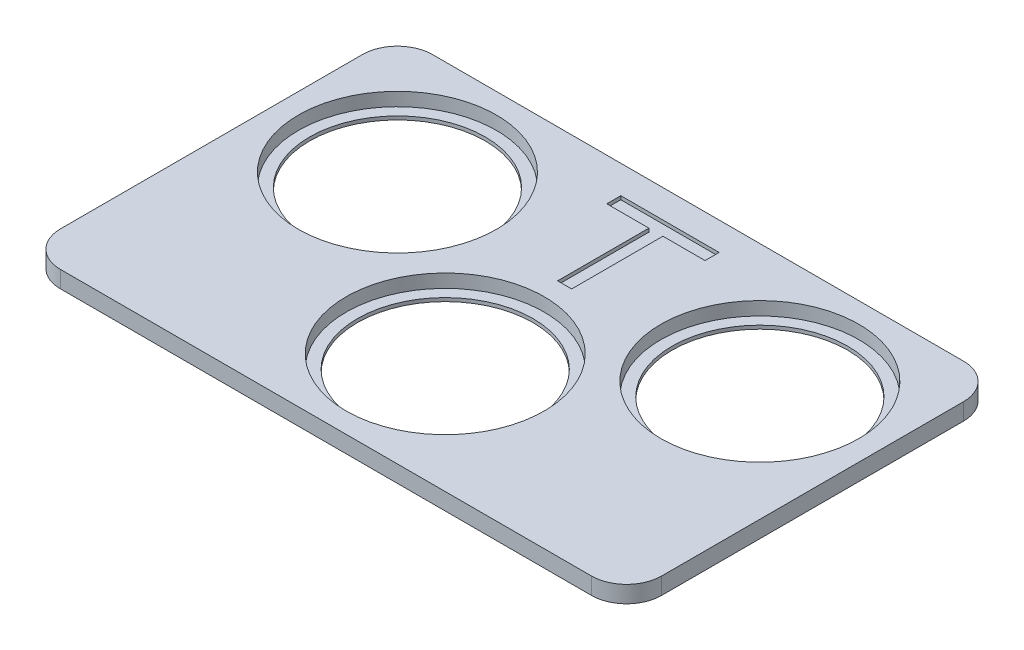
ISO-10303-21;
HEADER;
FILE_DESCRIPTION(('STEP AP214'),'2;1');
FILE_NAME('part.step','',(''),(''),'','','');
FILE_SCHEMA(('AUTOMOTIVE_DESIGN { 1 0 10303 214 1 1 1 1 }'));
ENDSEC;
DATA;
#1=APPLICATION_CONTEXT('core data for automotive mechanical design processes');
#2=APPLICATION_PROTOCOL_DEFINITION('international standard','automotive_design',2000,#1);
#3=PRODUCT_CONTEXT('',#1,'mechanical');
#4=PRODUCT('Part','Part','',(#3));
#5=PRODUCT_RELATED_PRODUCT_CATEGORY('part','',(#4));
#6=PRODUCT_DEFINITION_FORMATION('','',#4);
#7=PRODUCT_DEFINITION_CONTEXT('part definition',#1,'design');
#8=PRODUCT_DEFINITION('design','',#6,#7);
#9=PRODUCT_DEFINITION_SHAPE('','',#8);
#10=(LENGTH_UNIT() NAMED_UNIT(*) SI_UNIT(.MILLI.,.METRE.));
#11=(NAMED_UNIT(*) PLANE_ANGLE_UNIT() SI_UNIT($,.RADIAN.));
#12=(NAMED_UNIT(*) SI_UNIT($,.STERADIAN.) SOLID_ANGLE_UNIT());
#13=UNCERTAINTY_MEASURE_WITH_UNIT(LENGTH_MEASURE(1.E-05),#10,'distance_accuracy_value','');
#14=(GEOMETRIC_REPRESENTATION_CONTEXT(3) GLOBAL_UNCERTAINTY_ASSIGNED_CONTEXT((#13)) GLOBAL_UNIT_ASSIGNED_CONTEXT((#10,
#11,#12)) REPRESENTATION_CONTEXT('',''));
#15=CARTESIAN_POINT('',(0.,0.,0.));
#16=DIRECTION('',(0.,0.,1.));
#17=DIRECTION('',(1.,0.,0.));
#18=AXIS2_PLACEMENT_3D('',#15,#16,#17);
#19=CARTESIAN_POINT('',(42.8000000000002,2.4,-26.4899999999999));
#20=DIRECTION('',(-1.,0.,0.));
#21=DIRECTION('',(0.,0.,1.));
#22=AXIS2_PLACEMENT_3D('',#19,#20,#21);
#23=PLANE('',#22);
#24=DIRECTION('',(0.,0.,-1.));
#25=VECTOR('',#24,1.);
#26=CARTESIAN_POINT('',(42.8000000000002,0.,-26.4899999999999));
#27=LINE('',#26,#25);
#28=CARTESIAN_POINT('',(42.8000000000002,0.,21.4900000000001));
#29=VERTEX_POINT('',#28);
#30=CARTESIAN_POINT('',(42.8000000000002,0.,-21.4899999999999));
#31=VERTEX_POINT('',#30);
#32=EDGE_CURVE('E256',#29,#31,#27,.T.);
#33=ORIENTED_EDGE('',*,*,#32,.T.);
#34=DIRECTION('',(0.,-1.,0.));
#35=VECTOR('',#34,1.);
#36=CARTESIAN_POINT('',(42.8000000000002,2.4,-21.4899999999999));
#37=LINE('',#36,#35);
#38=CARTESIAN_POINT('',(42.8000000000002,2.4,-21.4899999999999));
#39=VERTEX_POINT('',#38);
#40=EDGE_CURVE('E322',#31,#39,#37,.F.);
#41=ORIENTED_EDGE('',*,*,#40,.T.);
#42=DIRECTION('',(0.,0.,-1.));
#43=VECTOR('',#42,1.);
#44=CARTESIAN_POINT('',(42.8000000000002,2.4,-26.4899999999999));
#45=LINE('',#44,#43);
#46=CARTESIAN_POINT('',(42.8000000000002,2.4,21.4900000000001));
#47=VERTEX_POINT('',#46);
#48=EDGE_CURVE('E260',#47,#39,#45,.T.);
#49=ORIENTED_EDGE('',*,*,#48,.F.);
#50=DIRECTION('',(0.,-1.,0.));
#51=VECTOR('',#50,1.);
#52=CARTESIAN_POINT('',(42.8000000000002,2.4,21.4900000000001));
#53=LINE('',#52,#51);
#54=EDGE_CURVE('E318',#47,#29,#53,.T.);
#55=ORIENTED_EDGE('',*,*,#54,.T.);
#56=EDGE_LOOP('',(#33,#41,#49,#55));
#57=FACE_BOUND('',#56,.T.);
#58=ADVANCED_FACE('F39',(#57),#23,.F.);
#59=CARTESIAN_POINT('',(-42.7999999999998,2.4,-26.4899999999999));
#60=DIRECTION('',(0.,0.,1.));
#61=DIRECTION('',(1.,0.,0.));
#62=AXIS2_PLACEMENT_3D('',#59,#60,#61);
#63=PLANE('',#62);
#64=DIRECTION('',(-1.,0.,0.));
#65=VECTOR('',#64,1.);
#66=CARTESIAN_POINT('',(-42.7999999999998,2.4,-26.4899999999999));
#67=LINE('',#66,#65);
#68=CARTESIAN_POINT('',(37.8000000000002,2.4,-26.4899999999999));
#69=VERTEX_POINT('',#68);
#70=CARTESIAN_POINT('',(-37.7999999999998,2.4,-26.4899999999999));
#71=VERTEX_POINT('',#70);
#72=EDGE_CURVE('E264',#69,#71,#67,.T.);
#73=ORIENTED_EDGE('',*,*,#72,.F.);
#74=DIRECTION('',(0.,-1.,0.));
#75=VECTOR('',#74,1.);
#76=CARTESIAN_POINT('',(37.8000000000002,2.4,-26.4899999999999));
#77=LINE('',#76,#75);
#78=CARTESIAN_POINT('',(37.8000000000002,0.,-26.4899999999999));
#79=VERTEX_POINT('',#78);
#80=EDGE_CURVE('E302',#69,#79,#77,.T.);
#81=ORIENTED_EDGE('',*,*,#80,.T.);
#82=DIRECTION('',(-1.,0.,0.));
#83=VECTOR('',#82,1.);
#84=CARTESIAN_POINT('',(-42.7999999999998,0.,-26.4899999999999));
#85=LINE('',#84,#83);
#86=CARTESIAN_POINT('',(-37.7999999999998,0.,-26.4899999999999));
#87=VERTEX_POINT('',#86);
#88=EDGE_CURVE('E280',#79,#87,#85,.T.);
#89=ORIENTED_EDGE('',*,*,#88,.T.);
#90=DIRECTION('',(0.,-1.,0.));
#91=VECTOR('',#90,1.);
#92=CARTESIAN_POINT('',(-37.7999999999998,2.4,-26.4899999999999));
#93=LINE('',#92,#91);
#94=EDGE_CURVE('E276',#87,#71,#93,.F.);
#95=ORIENTED_EDGE('',*,*,#94,.T.);
#96=EDGE_LOOP('',(#73,#81,#89,#95));
#97=FACE_BOUND('',#96,.T.);
#98=ADVANCED_FACE('F404',(#97),#63,.F.);
#99=CARTESIAN_POINT('',(-42.7999999999998,2.4,-26.4899999999999));
#100=DIRECTION('',(1.,0.,0.));
#101=DIRECTION('',(0.,0.,-1.));
#102=AXIS2_PLACEMENT_3D('',#99,#100,#101);
#103=PLANE('',#102);
#104=DIRECTION('',(0.,0.,1.));
#105=VECTOR('',#104,1.);
#106=CARTESIAN_POINT('',(-42.7999999999998,0.,-26.4899999999999));
#107=LINE('',#106,#105);
#108=CARTESIAN_POINT('',(-42.7999999999998,0.,-21.4899999999999));
#109=VERTEX_POINT('',#108);
#110=CARTESIAN_POINT('',(-42.7999999999998,0.,21.4900000000001));
#111=VERTEX_POINT('',#110);
#112=EDGE_CURVE('E284',#109,#111,#107,.T.);
#113=ORIENTED_EDGE('',*,*,#112,.T.);
#114=DIRECTION('',(0.,-1.,0.));
#115=VECTOR('',#114,1.);
#116=CARTESIAN_POINT('',(-42.7999999999998,2.4,21.4900000000001));
#117=LINE('',#116,#115);
#118=CARTESIAN_POINT('',(-42.7999999999998,2.4,21.4900000000001));
#119=VERTEX_POINT('',#118);
#120=EDGE_CURVE('E347',#111,#119,#117,.F.);
#121=ORIENTED_EDGE('',*,*,#120,.T.);
#122=DIRECTION('',(0.,0.,1.));
#123=VECTOR('',#122,1.);
#124=CARTESIAN_POINT('',(-42.7999999999998,2.4,-26.4899999999999));
#125=LINE('',#124,#123);
#126=CARTESIAN_POINT('',(-42.7999999999998,2.4,-21.4899999999999));
#127=VERTEX_POINT('',#126);
#128=EDGE_CURVE('E269',#127,#119,#125,.T.);
#129=ORIENTED_EDGE('',*,*,#128,.F.);
#130=DIRECTION('',(0.,-1.,0.));
#131=VECTOR('',#130,1.);
#132=CARTESIAN_POINT('',(-42.7999999999998,2.4,-21.4899999999999));
#133=LINE('',#132,#131);
#134=EDGE_CURVE('E343',#127,#109,#133,.T.);
#135=ORIENTED_EDGE('',*,*,#134,.T.);
#136=EDGE_LOOP('',(#113,#121,#129,#135));
#137=FACE_BOUND('',#136,.T.);
#138=ADVANCED_FACE('F410',(#137),#103,.F.);
#139=CARTESIAN_POINT('',(-42.7999999999998,2.4,26.4900000000001));
#140=DIRECTION('',(0.,0.,-1.));
#141=DIRECTION('',(-1.,0.,0.));
#142=AXIS2_PLACEMENT_3D('',#139,#140,#141);
#143=PLANE('',#142);
#144=DIRECTION('',(1.,0.,0.));
#145=VECTOR('',#144,1.);
#146=CARTESIAN_POINT('',(-42.7999999999998,0.,26.4900000000001));
#147=LINE('',#146,#145);
#148=CARTESIAN_POINT('',(-37.7999999999998,0.,26.4900000000001));
#149=VERTEX_POINT('',#148);
#150=CARTESIAN_POINT('',(37.8000000000002,0.,26.4900000000001));
#151=VERTEX_POINT('',#150);
#152=EDGE_CURVE('E265',#149,#151,#147,.T.);
#153=ORIENTED_EDGE('',*,*,#152,.T.);
#154=DIRECTION('',(0.,-1.,0.));
#155=VECTOR('',#154,1.);
#156=CARTESIAN_POINT('',(37.8000000000002,2.4,26.4900000000001));
#157=LINE('',#156,#155);
#158=CARTESIAN_POINT('',(37.8000000000002,2.4,26.4900000000001));
#159=VERTEX_POINT('',#158);
#160=EDGE_CURVE('E63',#151,#159,#157,.F.);
#161=ORIENTED_EDGE('',*,*,#160,.T.);
#162=DIRECTION('',(1.,0.,0.));
#163=VECTOR('',#162,1.);
#164=CARTESIAN_POINT('',(-42.7999999999998,2.4,26.4900000000001));
#165=LINE('',#164,#163);
#166=CARTESIAN_POINT('',(-37.7999999999998,2.4,26.4900000000001));
#167=VERTEX_POINT('',#166);
#168=EDGE_CURVE('E273',#167,#159,#165,.T.);
#169=ORIENTED_EDGE('',*,*,#168,.F.);
#170=DIRECTION('',(0.,-1.,0.));
#171=VECTOR('',#170,1.);
#172=CARTESIAN_POINT('',(-37.7999999999998,2.4,26.4900000000001));
#173=LINE('',#172,#171);
#174=EDGE_CURVE('E337',#167,#149,#173,.T.);
#175=ORIENTED_EDGE('',*,*,#174,.T.);
#176=EDGE_LOOP('',(#153,#161,#169,#175));
#177=FACE_BOUND('',#176,.T.);
#178=ADVANCED_FACE('F436',(#177),#143,.F.);
#179=CARTESIAN_POINT('',(0.,2.4,0.));
#180=DIRECTION('',(0.,1.,0.));
#181=DIRECTION('',(0.,0.,1.));
#182=AXIS2_PLACEMENT_3D('',#179,#180,#181);
#183=PLANE('',#182);
#184=DIRECTION('',(0.,0.,-1.));
#185=VECTOR('',#184,1.);
#186=CARTESIAN_POINT('',(0.999999999999999,2.4,0.));
#187=LINE('',#186,#185);
#188=CARTESIAN_POINT('',(1.,2.4,-7.48999999999991));
#189=VERTEX_POINT('',#188);
#190=CARTESIAN_POINT('',(1.,2.4,-20.4899999999999));
#191=VERTEX_POINT('',#190);
#192=EDGE_CURVE('E11',#189,#191,#187,.T.);
#193=ORIENTED_EDGE('',*,*,#192,.F.);
#194=DIRECTION('',(-1.,0.,0.));
#195=VECTOR('',#194,1.);
#196=CARTESIAN_POINT('',(0.,2.4,-7.48999999999991));
#197=LINE('',#196,#195);
#198=CARTESIAN_POINT('',(-1.,2.4,-7.48999999999991));
#199=VERTEX_POINT('',#198);
#200=EDGE_CURVE('E350',#189,#199,#197,.T.);
#201=ORIENTED_EDGE('',*,*,#200,.T.);
#202=DIRECTION('',(0.,0.,-1.));
#203=VECTOR('',#202,1.);
#204=CARTESIAN_POINT('',(-0.999999999999999,2.4,0.));
#205=LINE('',#204,#203);
#206=CARTESIAN_POINT('',(-1.,2.4,-20.4899999999999));
#207=VERTEX_POINT('',#206);
#208=EDGE_CURVE('E354',#199,#207,#205,.T.);
#209=ORIENTED_EDGE('',*,*,#208,.T.);
#210=DIRECTION('',(-1.,0.,0.));
#211=VECTOR('',#210,1.);
#212=CARTESIAN_POINT('',(0.,2.4,-20.4899999999999));
#213=LINE('',#212,#211);
#214=CARTESIAN_POINT('',(-7.,2.4,-20.4899999999999));
#215=VERTEX_POINT('',#214);
#216=EDGE_CURVE('E358',#207,#215,#213,.T.);
#217=ORIENTED_EDGE('',*,*,#216,.T.);
#218=DIRECTION('',(0.,0.,-1.));
#219=VECTOR('',#218,1.);
#220=CARTESIAN_POINT('',(-7.00000000000002,2.4,0.));
#221=LINE('',#220,#219);
#222=CARTESIAN_POINT('',(-7.,2.4,-22.4899999999999));
#223=VERTEX_POINT('',#222);
#224=EDGE_CURVE('E362',#215,#223,#221,.T.);
#225=ORIENTED_EDGE('',*,*,#224,.T.);
#226=DIRECTION('',(-1.,0.,0.));
#227=VECTOR('',#226,1.);
#228=CARTESIAN_POINT('',(0.,2.4,-22.4899999999999));
#229=LINE('',#228,#227);
#230=CARTESIAN_POINT('',(7.,2.4,-22.4899999999999));
#231=VERTEX_POINT('',#230);
#232=EDGE_CURVE('E366',#231,#223,#229,.T.);
#233=ORIENTED_EDGE('',*,*,#232,.F.);
#234=DIRECTION('',(0.,0.,-1.));
#235=VECTOR('',#234,1.);
#236=CARTESIAN_POINT('',(7.,2.4,0.));
#237=LINE('',#236,#235);
#238=CARTESIAN_POINT('',(7.,2.4,-20.4899999999999));
#239=VERTEX_POINT('',#238);
#240=EDGE_CURVE('E369',#239,#231,#237,.T.);
#241=ORIENTED_EDGE('',*,*,#240,.F.);
#242=DIRECTION('',(-1.,0.,0.));
#243=VECTOR('',#242,1.);
#244=CARTESIAN_POINT('',(0.,2.4,-20.4899999999999));
#245=LINE('',#244,#243);
#246=EDGE_CURVE('E48',#239,#191,#245,.T.);
#247=ORIENTED_EDGE('',*,*,#246,.T.);
#248=EDGE_LOOP('',(#193,#201,#209,#217,#225,#233,#241,#247));
#249=FACE_BOUND('',#248,.T.);
#250=CARTESIAN_POINT('',(0.,2.4,9.51000000000009));
#251=DIRECTION('',(0.,1.,0.));
#252=DIRECTION('',(0.,0.,1.));
#253=AXIS2_PLACEMENT_3D('',#250,#251,#252);
#254=CIRCLE('',#253,14.1);
#255=CARTESIAN_POINT('',(0.,2.4,23.6100000000001));
#256=VERTEX_POINT('',#255);
#257=EDGE_CURVE('E238',#256,#256,#254,.T.);
#258=ORIENTED_EDGE('',*,*,#257,.F.);
#259=EDGE_LOOP('',(#258));
#260=FACE_BOUND('',#259,.T.);
#261=CARTESIAN_POINT('',(25.8000000000002,2.4,-9.4899999999999));
#262=DIRECTION('',(0.,1.,0.));
#263=DIRECTION('',(0.,0.,1.));
#264=AXIS2_PLACEMENT_3D('',#261,#262,#263);
#265=CIRCLE('',#264,14.1);
#266=CARTESIAN_POINT('',(25.8000000000002,2.4,4.6100000000001));
#267=VERTEX_POINT('',#266);
#268=EDGE_CURVE('E239',#267,#267,#265,.T.);
#269=ORIENTED_EDGE('',*,*,#268,.F.);
#270=EDGE_LOOP('',(#269));
#271=FACE_BOUND('',#270,.T.);
#272=CARTESIAN_POINT('',(-25.7999999999998,2.4,-9.4899999999999));
#273=DIRECTION('',(0.,1.,0.));
#274=DIRECTION('',(0.,0.,1.));
#275=AXIS2_PLACEMENT_3D('',#272,#273,#274);
#276=CIRCLE('',#275,14.1);
#277=CARTESIAN_POINT('',(-25.7999999999998,2.4,4.6100000000001));
#278=VERTEX_POINT('',#277);
#279=EDGE_CURVE('E248',#278,#278,#276,.T.);
#280=ORIENTED_EDGE('',*,*,#279,.F.);
#281=EDGE_LOOP('',(#280));
#282=FACE_BOUND('',#281,.T.);
#283=ORIENTED_EDGE('',*,*,#48,.T.);
#284=CARTESIAN_POINT('',(37.8000000000002,2.4,-21.4899999999999));
#285=DIRECTION('',(0.,1.,0.));
#286=DIRECTION('',(0.,0.,1.));
#287=AXIS2_PLACEMENT_3D('',#284,#285,#286);
#288=CIRCLE('',#287,5.);
#289=EDGE_CURVE('E334',#39,#69,#288,.T.);
#290=ORIENTED_EDGE('',*,*,#289,.T.);
#291=ORIENTED_EDGE('',*,*,#72,.T.);
#292=CARTESIAN_POINT('',(-37.7999999999998,2.4,-21.4899999999999));
#293=DIRECTION('',(0.,1.,0.));
#294=DIRECTION('',(0.,0.,1.));
#295=AXIS2_PLACEMENT_3D('',#292,#293,#294);
#296=CIRCLE('',#295,5.);
#297=EDGE_CURVE('E325',#71,#127,#296,.T.);
#298=ORIENTED_EDGE('',*,*,#297,.T.);
#299=ORIENTED_EDGE('',*,*,#128,.T.);
#300=CARTESIAN_POINT('',(-37.7999999999998,2.4,21.4900000000001));
#301=DIRECTION('',(0.,1.,0.));
#302=DIRECTION('',(0.,0.,1.));
#303=AXIS2_PLACEMENT_3D('',#300,#301,#302);
#304=CIRCLE('',#303,5.);
#305=EDGE_CURVE('E328',#119,#167,#304,.T.);
#306=ORIENTED_EDGE('',*,*,#305,.T.);
#307=ORIENTED_EDGE('',*,*,#168,.T.);
#308=CARTESIAN_POINT('',(37.8000000000002,2.4,21.4900000000001));
#309=DIRECTION('',(0.,1.,0.));
#310=DIRECTION('',(0.,0.,1.));
#311=AXIS2_PLACEMENT_3D('',#308,#309,#310);
#312=CIRCLE('',#311,5.);
#313=EDGE_CURVE('E331',#159,#47,#312,.T.);
#314=ORIENTED_EDGE('',*,*,#313,.T.);
#315=EDGE_LOOP('',(#283,#290,#291,#298,#299,#306,#307,#314));
#316=FACE_BOUND('',#315,.T.);
#317=ADVANCED_FACE('F374',(#249,#260,#271,#282,#316),#183,.T.);
#318=CARTESIAN_POINT('',(0.,0.,0.));
#319=DIRECTION('',(0.,1.,0.));
#320=DIRECTION('',(0.,0.,1.));
#321=AXIS2_PLACEMENT_3D('',#318,#319,#320);
#322=PLANE('',#321);
#323=CARTESIAN_POINT('',(-25.7999999999998,0.,-9.4899999999999));
#324=DIRECTION('',(0.,1.,0.));
#325=DIRECTION('',(0.,0.,1.));
#326=AXIS2_PLACEMENT_3D('',#323,#324,#325);
#327=CIRCLE('',#326,12.5);
#328=CARTESIAN_POINT('',(-25.7999999999998,0.,3.0100000000001));
#329=VERTEX_POINT('',#328);
#330=EDGE_CURVE('E243',#329,#329,#327,.T.);
#331=ORIENTED_EDGE('',*,*,#330,.T.);
#332=EDGE_LOOP('',(#331));
#333=FACE_BOUND('',#332,.T.);
#334=CARTESIAN_POINT('',(0.,0.,9.51000000000009));
#335=DIRECTION('',(0.,1.,0.));
#336=DIRECTION('',(0.,0.,1.));
#337=AXIS2_PLACEMENT_3D('',#334,#335,#336);
#338=CIRCLE('',#337,12.5);
#339=CARTESIAN_POINT('',(0.,0.,22.0100000000001));
#340=VERTEX_POINT('',#339);
#341=EDGE_CURVE('E293',#340,#340,#338,.T.);
#342=ORIENTED_EDGE('',*,*,#341,.T.);
#343=EDGE_LOOP('',(#342));
#344=FACE_BOUND('',#343,.T.);
#345=CARTESIAN_POINT('',(25.8000000000002,0.,-9.4899999999999));
#346=DIRECTION('',(0.,1.,0.));
#347=DIRECTION('',(0.,0.,1.));
#348=AXIS2_PLACEMENT_3D('',#345,#346,#347);
#349=CIRCLE('',#348,12.5);
#350=CARTESIAN_POINT('',(25.8000000000002,0.,3.0100000000001));
#351=VERTEX_POINT('',#350);
#352=EDGE_CURVE('E226',#351,#351,#349,.T.);
#353=ORIENTED_EDGE('',*,*,#352,.T.);
#354=EDGE_LOOP('',(#353));
#355=FACE_BOUND('',#354,.T.);
#356=ORIENTED_EDGE('',*,*,#88,.F.);
#357=CARTESIAN_POINT('',(37.8000000000002,0.,-21.4899999999999));
#358=DIRECTION('',(0.,1.,0.));
#359=DIRECTION('',(0.,0.,1.));
#360=AXIS2_PLACEMENT_3D('',#357,#358,#359);
#361=CIRCLE('',#360,5.);
#362=EDGE_CURVE('E315',#79,#31,#361,.F.);
#363=ORIENTED_EDGE('',*,*,#362,.T.);
#364=ORIENTED_EDGE('',*,*,#32,.F.);
#365=CARTESIAN_POINT('',(37.8000000000002,0.,21.4900000000001));
#366=DIRECTION('',(0.,1.,0.));
#367=DIRECTION('',(0.,0.,1.));
#368=AXIS2_PLACEMENT_3D('',#365,#366,#367);
#369=CIRCLE('',#368,5.);
#370=EDGE_CURVE('E312',#29,#151,#369,.F.);
#371=ORIENTED_EDGE('',*,*,#370,.T.);
#372=ORIENTED_EDGE('',*,*,#152,.F.);
#373=CARTESIAN_POINT('',(-37.7999999999998,0.,21.4900000000001));
#374=DIRECTION('',(0.,1.,0.));
#375=DIRECTION('',(0.,0.,1.));
#376=AXIS2_PLACEMENT_3D('',#373,#374,#375);
#377=CIRCLE('',#376,5.);
#378=EDGE_CURVE('E309',#149,#111,#377,.F.);
#379=ORIENTED_EDGE('',*,*,#378,.T.);
#380=ORIENTED_EDGE('',*,*,#112,.F.);
#381=CARTESIAN_POINT('',(-37.7999999999998,0.,-21.4899999999999));
#382=DIRECTION('',(0.,1.,0.));
#383=DIRECTION('',(0.,0.,1.));
#384=AXIS2_PLACEMENT_3D('',#381,#382,#383);
#385=CIRCLE('',#384,5.);
#386=EDGE_CURVE('E306',#109,#87,#385,.F.);
#387=ORIENTED_EDGE('',*,*,#386,.T.);
#388=EDGE_LOOP('',(#356,#363,#364,#371,#372,#379,#380,#387));
#389=FACE_BOUND('',#388,.T.);
#390=ADVANCED_FACE('F440',(#333,#344,#355,#389),#322,.F.);
#391=CARTESIAN_POINT('',(-25.7999999999998,0.5,-9.4899999999999));
#392=DIRECTION('',(0.,1.,0.));
#393=DIRECTION('',(0.,0.,1.));
#394=AXIS2_PLACEMENT_3D('',#391,#392,#393);
#395=CYLINDRICAL_SURFACE('',#394,14.1);
#396=CARTESIAN_POINT('',(-25.7999999999998,0.5,-9.4899999999999));
#397=DIRECTION('',(0.,1.,0.));
#398=DIRECTION('',(0.,0.,1.));
#399=AXIS2_PLACEMENT_3D('',#396,#397,#398);
#400=CIRCLE('',#399,14.1);
#401=CARTESIAN_POINT('',(-25.7999999999998,0.5,4.6100000000001));
#402=VERTEX_POINT('',#401);
#403=EDGE_CURVE('E252',#402,#402,#400,.T.);
#404=CARTESIAN_POINT('',(-25.7999999999998,0.5,4.6100000000001));
#405=CARTESIAN_POINT('',(-25.7999999999998,0.519791666666666,4.6100000000001));
#406=CARTESIAN_POINT('',(-25.7999999999998,0.539583333333333,4.6100000000001));
#407=CARTESIAN_POINT('',(-25.7999999999998,0.579166666666666,4.6100000000001));
#408=CARTESIAN_POINT('',(-25.7999999999998,0.598958333333333,4.6100000000001));
#409=CARTESIAN_POINT('',(-25.7999999999998,0.638541666666666,4.6100000000001));
#410=CARTESIAN_POINT('',(-25.7999999999998,0.658333333333333,4.6100000000001));
#411=CARTESIAN_POINT('',(-25.7999999999998,0.697916666666666,4.6100000000001));
#412=CARTESIAN_POINT('',(-25.7999999999998,0.717708333333333,4.6100000000001));
#413=CARTESIAN_POINT('',(-25.7999999999998,0.757291666666666,4.6100000000001));
#414=CARTESIAN_POINT('',(-25.7999999999998,0.777083333333333,4.6100000000001));
#415=CARTESIAN_POINT('',(-25.7999999999998,0.816666666666666,4.6100000000001));
#416=CARTESIAN_POINT('',(-25.7999999999998,0.836458333333333,4.6100000000001));
#417=CARTESIAN_POINT('',(-25.7999999999998,0.876041666666666,4.6100000000001));
#418=CARTESIAN_POINT('',(-25.7999999999998,0.895833333333333,4.6100000000001));
#419=CARTESIAN_POINT('',(-25.7999999999998,0.935416666666666,4.6100000000001));
#420=CARTESIAN_POINT('',(-25.7999999999998,0.955208333333333,4.6100000000001));
#421=CARTESIAN_POINT('',(-25.7999999999998,0.994791666666666,4.6100000000001));
#422=CARTESIAN_POINT('',(-25.7999999999998,1.01458333333333,4.6100000000001));
#423=CARTESIAN_POINT('',(-25.7999999999998,1.05416666666667,4.6100000000001));
#424=CARTESIAN_POINT('',(-25.7999999999998,1.07395833333333,4.6100000000001));
#425=CARTESIAN_POINT('',(-25.7999999999998,1.11354166666667,4.6100000000001));
#426=CARTESIAN_POINT('',(-25.7999999999998,1.13333333333333,4.6100000000001));
#427=CARTESIAN_POINT('',(-25.7999999999998,1.17291666666667,4.6100000000001));
#428=CARTESIAN_POINT('',(-25.7999999999998,1.19270833333333,4.6100000000001));
#429=CARTESIAN_POINT('',(-25.7999999999998,1.23229166666667,4.6100000000001));
#430=CARTESIAN_POINT('',(-25.7999999999998,1.25208333333333,4.6100000000001));
#431=CARTESIAN_POINT('',(-25.7999999999998,1.29166666666667,4.6100000000001));
#432=CARTESIAN_POINT('',(-25.7999999999998,1.31145833333333,4.6100000000001));
#433=CARTESIAN_POINT('',(-25.7999999999998,1.35104166666667,4.6100000000001));
#434=CARTESIAN_POINT('',(-25.7999999999998,1.37083333333333,4.6100000000001));
#435=CARTESIAN_POINT('',(-25.7999999999998,1.41041666666667,4.6100000000001));
#436=CARTESIAN_POINT('',(-25.7999999999998,1.43020833333333,4.6100000000001));
#437=CARTESIAN_POINT('',(-25.7999999999998,1.46979166666667,4.6100000000001));
#438=CARTESIAN_POINT('',(-25.7999999999998,1.48958333333333,4.6100000000001));
#439=CARTESIAN_POINT('',(-25.7999999999998,1.52916666666667,4.6100000000001));
#440=CARTESIAN_POINT('',(-25.7999999999998,1.54895833333333,4.6100000000001));
#441=CARTESIAN_POINT('',(-25.7999999999998,1.58854166666667,4.6100000000001));
#442=CARTESIAN_POINT('',(-25.7999999999998,1.60833333333333,4.6100000000001));
#443=CARTESIAN_POINT('',(-25.7999999999998,1.64791666666667,4.6100000000001));
#444=CARTESIAN_POINT('',(-25.7999999999998,1.66770833333333,4.6100000000001));
#445=CARTESIAN_POINT('',(-25.7999999999998,1.70729166666667,4.6100000000001));
#446=CARTESIAN_POINT('',(-25.7999999999998,1.72708333333333,4.6100000000001));
#447=CARTESIAN_POINT('',(-25.7999999999998,1.76666666666667,4.6100000000001));
#448=CARTESIAN_POINT('',(-25.7999999999998,1.78645833333333,4.6100000000001));
#449=CARTESIAN_POINT('',(-25.7999999999998,1.82604166666667,4.6100000000001));
#450=CARTESIAN_POINT('',(-25.7999999999998,1.84583333333333,4.6100000000001));
#451=CARTESIAN_POINT('',(-25.7999999999998,1.88541666666667,4.6100000000001));
#452=CARTESIAN_POINT('',(-25.7999999999998,1.90520833333333,4.6100000000001));
#453=CARTESIAN_POINT('',(-25.7999999999998,1.94479166666667,4.6100000000001));
#454=CARTESIAN_POINT('',(-25.7999999999998,1.96458333333333,4.6100000000001));
#455=CARTESIAN_POINT('',(-25.7999999999998,2.00416666666667,4.6100000000001));
#456=CARTESIAN_POINT('',(-25.7999999999998,2.02395833333333,4.6100000000001));
#457=CARTESIAN_POINT('',(-25.7999999999998,2.06354166666667,4.6100000000001));
#458=CARTESIAN_POINT('',(-25.7999999999998,2.08333333333333,4.6100000000001));
#459=CARTESIAN_POINT('',(-25.7999999999998,2.12291666666667,4.6100000000001));
#460=CARTESIAN_POINT('',(-25.7999999999998,2.14270833333333,4.6100000000001));
#461=CARTESIAN_POINT('',(-25.7999999999998,2.18229166666667,4.6100000000001));
#462=CARTESIAN_POINT('',(-25.7999999999998,2.20208333333333,4.6100000000001));
#463=CARTESIAN_POINT('',(-25.7999999999998,2.24166666666667,4.6100000000001));
#464=CARTESIAN_POINT('',(-25.7999999999998,2.26145833333333,4.6100000000001));
#465=CARTESIAN_POINT('',(-25.7999999999998,2.30104166666667,4.6100000000001));
#466=CARTESIAN_POINT('',(-25.7999999999998,2.32083333333333,4.6100000000001));
#467=CARTESIAN_POINT('',(-25.7999999999998,2.36041666666667,4.6100000000001));
#468=CARTESIAN_POINT('',(-25.7999999999998,2.38020833333333,4.6100000000001));
#469=CARTESIAN_POINT('',(-25.7999999999998,2.4,4.6100000000001));
#470=B_SPLINE_CURVE_WITH_KNOTS('',3,(#404,#405,#406,#407,#408,#409,#410,#411,#412,#413,#414,
#415,#416,#417,#418,#419,#420,#421,#422,#423,#424,#425,#426,#427,#428,#429,#430,#431,#432,#433,
#434,#435,#436,#437,#438,#439,#440,#441,#442,#443,#444,#445,#446,#447,#448,#449,#450,#451,#452,
#453,#454,#455,#456,#457,#458,#459,#460,#461,#462,#463,#464,#465,#466,#467,#468,#469),
.UNSPECIFIED.,.F.,.F.,(4,2,2,2,2,2,2,2,2,2,2,2,2,2,2,2,2,2,2,2,2,2,2,2,2,2,2,2,2,2,2,2,4),(0.,
0.059375,0.11875,0.178125,0.2375,0.296875,0.35625,0.415625,0.475,0.534375,0.59375,0.653125,
0.7125,0.771875,0.83125,0.890625,0.95,1.009375,1.06875,1.128125,1.1875,1.246875,1.30625,
1.365625,1.425,1.484375,1.54375,1.603125,1.6625,1.721875,1.78125,1.840625,1.9),.UNSPECIFIED.);
#471=EDGE_CURVE('BSEAM461',#402,#278,#470,.T.);
#472=ORIENTED_EDGE('',*,*,#403,.F.);
#473=ORIENTED_EDGE('',*,*,#279,.T.);
#474=ORIENTED_EDGE('',*,*,#471,.T.);
#475=ORIENTED_EDGE('',*,*,#471,.F.);
#476=EDGE_LOOP('',(#472,#474,#473,#475));
#477=FACE_BOUND('',#476,.T.);
#478=ADVANCED_FACE('F461',(#477),#395,.F.);
#479=CARTESIAN_POINT('',(-25.7999999999998,0.5,-9.4899999999999));
#480=DIRECTION('',(0.,1.,0.));
#481=DIRECTION('',(0.,0.,1.));
#482=AXIS2_PLACEMENT_3D('',#479,#480,#481);
#483=PLANE('',#482);
#484=CARTESIAN_POINT('',(-25.7999999999998,0.5,-9.4899999999999));
#485=DIRECTION('',(0.,1.,0.));
#486=DIRECTION('',(0.,0.,1.));
#487=AXIS2_PLACEMENT_3D('',#484,#485,#486);
#488=CIRCLE('',#487,12.5);
#489=CARTESIAN_POINT('',(-25.7999999999998,0.5,3.0100000000001));
#490=VERTEX_POINT('',#489);
#491=EDGE_CURVE('E222',#490,#490,#488,.T.);
#492=ORIENTED_EDGE('',*,*,#491,.F.);
#493=EDGE_LOOP('',(#492));
#494=FACE_BOUND('',#493,.T.);
#495=ORIENTED_EDGE('',*,*,#403,.T.);
#496=EDGE_LOOP('',(#495));
#497=FACE_BOUND('',#496,.T.);
#498=ADVANCED_FACE('F467',(#494,#497),#483,.T.);
#499=CARTESIAN_POINT('',(25.8000000000002,0.5,-9.4899999999999));
#500=DIRECTION('',(0.,1.,0.));
#501=DIRECTION('',(0.,0.,1.));
#502=AXIS2_PLACEMENT_3D('',#499,#500,#501);
#503=CYLINDRICAL_SURFACE('',#502,14.1);
#504=CARTESIAN_POINT('',(25.8000000000002,0.5,-9.4899999999999));
#505=DIRECTION('',(0.,1.,0.));
#506=DIRECTION('',(0.,0.,1.));
#507=AXIS2_PLACEMENT_3D('',#504,#505,#506);
#508=CIRCLE('',#507,14.1);
#509=CARTESIAN_POINT('',(25.8000000000002,0.5,4.6100000000001));
#510=VERTEX_POINT('',#509);
#511=EDGE_CURVE('E234',#510,#510,#508,.T.);
#512=CARTESIAN_POINT('',(25.8000000000002,0.5,4.6100000000001));
#513=CARTESIAN_POINT('',(25.8000000000002,0.519791666666666,4.6100000000001));
#514=CARTESIAN_POINT('',(25.8000000000002,0.539583333333333,4.6100000000001));
#515=CARTESIAN_POINT('',(25.8000000000002,0.579166666666666,4.6100000000001));
#516=CARTESIAN_POINT('',(25.8000000000002,0.598958333333333,4.6100000000001));
#517=CARTESIAN_POINT('',(25.8000000000002,0.638541666666666,4.6100000000001));
#518=CARTESIAN_POINT('',(25.8000000000002,0.658333333333333,4.6100000000001));
#519=CARTESIAN_POINT('',(25.8000000000002,0.697916666666666,4.6100000000001));
#520=CARTESIAN_POINT('',(25.8000000000002,0.717708333333333,4.6100000000001));
#521=CARTESIAN_POINT('',(25.8000000000002,0.757291666666666,4.6100000000001));
#522=CARTESIAN_POINT('',(25.8000000000002,0.777083333333333,4.6100000000001));
#523=CARTESIAN_POINT('',(25.8000000000002,0.816666666666666,4.6100000000001));
#524=CARTESIAN_POINT('',(25.8000000000002,0.836458333333333,4.6100000000001));
#525=CARTESIAN_POINT('',(25.8000000000002,0.876041666666666,4.6100000000001));
#526=CARTESIAN_POINT('',(25.8000000000002,0.895833333333333,4.6100000000001));
#527=CARTESIAN_POINT('',(25.8000000000002,0.935416666666666,4.6100000000001));
#528=CARTESIAN_POINT('',(25.8000000000002,0.955208333333333,4.6100000000001));
#529=CARTESIAN_POINT('',(25.8000000000002,0.994791666666666,4.6100000000001));
#530=CARTESIAN_POINT('',(25.8000000000002,1.01458333333333,4.6100000000001));
#531=CARTESIAN_POINT('',(25.8000000000002,1.05416666666667,4.6100000000001));
#532=CARTESIAN_POINT('',(25.8000000000002,1.07395833333333,4.6100000000001));
#533=CARTESIAN_POINT('',(25.8000000000002,1.11354166666667,4.6100000000001));
#534=CARTESIAN_POINT('',(25.8000000000002,1.13333333333333,4.6100000000001));
#535=CARTESIAN_POINT('',(25.8000000000002,1.17291666666667,4.6100000000001));
#536=CARTESIAN_POINT('',(25.8000000000002,1.19270833333333,4.6100000000001));
#537=CARTESIAN_POINT('',(25.8000000000002,1.23229166666667,4.6100000000001));
#538=CARTESIAN_POINT('',(25.8000000000002,1.25208333333333,4.6100000000001));
#539=CARTESIAN_POINT('',(25.8000000000002,1.29166666666667,4.6100000000001));
#540=CARTESIAN_POINT('',(25.8000000000002,1.31145833333333,4.6100000000001));
#541=CARTESIAN_POINT('',(25.8000000000002,1.35104166666667,4.6100000000001));
#542=CARTESIAN_POINT('',(25.8000000000002,1.37083333333333,4.6100000000001));
#543=CARTESIAN_POINT('',(25.8000000000002,1.41041666666667,4.6100000000001));
#544=CARTESIAN_POINT('',(25.8000000000002,1.43020833333333,4.6100000000001));
#545=CARTESIAN_POINT('',(25.8000000000002,1.46979166666667,4.6100000000001));
#546=CARTESIAN_POINT('',(25.8000000000002,1.48958333333333,4.6100000000001));
#547=CARTESIAN_POINT('',(25.8000000000002,1.52916666666667,4.6100000000001));
#548=CARTESIAN_POINT('',(25.8000000000002,1.54895833333333,4.6100000000001));
#549=CARTESIAN_POINT('',(25.8000000000002,1.58854166666667,4.6100000000001));
#550=CARTESIAN_POINT('',(25.8000000000002,1.60833333333333,4.6100000000001));
#551=CARTESIAN_POINT('',(25.8000000000002,1.64791666666667,4.6100000000001));
#552=CARTESIAN_POINT('',(25.8000000000002,1.66770833333333,4.6100000000001));
#553=CARTESIAN_POINT('',(25.8000000000002,1.70729166666667,4.6100000000001));
#554=CARTESIAN_POINT('',(25.8000000000002,1.72708333333333,4.6100000000001));
#555=CARTESIAN_POINT('',(25.8000000000002,1.76666666666667,4.6100000000001));
#556=CARTESIAN_POINT('',(25.8000000000002,1.78645833333333,4.6100000000001));
#557=CARTESIAN_POINT('',(25.8000000000002,1.82604166666667,4.6100000000001));
#558=CARTESIAN_POINT('',(25.8000000000002,1.84583333333333,4.6100000000001));
#559=CARTESIAN_POINT('',(25.8000000000002,1.88541666666667,4.6100000000001));
#560=CARTESIAN_POINT('',(25.8000000000002,1.90520833333333,4.6100000000001));
#561=CARTESIAN_POINT('',(25.8000000000002,1.94479166666667,4.6100000000001));
#562=CARTESIAN_POINT('',(25.8000000000002,1.96458333333333,4.6100000000001));
#563=CARTESIAN_POINT('',(25.8000000000002,2.00416666666667,4.6100000000001));
#564=CARTESIAN_POINT('',(25.8000000000002,2.02395833333333,4.6100000000001));
#565=CARTESIAN_POINT('',(25.8000000000002,2.06354166666667,4.6100000000001));
#566=CARTESIAN_POINT('',(25.8000000000002,2.08333333333333,4.6100000000001));
#567=CARTESIAN_POINT('',(25.8000000000002,2.12291666666667,4.6100000000001));
#568=CARTESIAN_POINT('',(25.8000000000002,2.14270833333333,4.6100000000001));
#569=CARTESIAN_POINT('',(25.8000000000002,2.18229166666667,4.6100000000001));
#570=CARTESIAN_POINT('',(25.8000000000002,2.20208333333333,4.6100000000001));
#571=CARTESIAN_POINT('',(25.8000000000002,2.24166666666667,4.6100000000001));
#572=CARTESIAN_POINT('',(25.8000000000002,2.26145833333333,4.6100000000001));
#573=CARTESIAN_POINT('',(25.8000000000002,2.30104166666667,4.6100000000001));
#574=CARTESIAN_POINT('',(25.8000000000002,2.32083333333333,4.6100000000001));
#575=CARTESIAN_POINT('',(25.8000000000002,2.36041666666667,4.6100000000001));
#576=CARTESIAN_POINT('',(25.8000000000002,2.38020833333333,4.6100000000001));
#577=CARTESIAN_POINT('',(25.8000000000002,2.4,4.6100000000001));
#578=B_SPLINE_CURVE_WITH_KNOTS('',3,(#512,#513,#514,#515,#516,#517,#518,#519,#520,#521,#522,
#523,#524,#525,#526,#527,#528,#529,#530,#531,#532,#533,#534,#535,#536,#537,#538,#539,#540,#541,
#542,#543,#544,#545,#546,#547,#548,#549,#550,#551,#552,#553,#554,#555,#556,#557,#558,#559,#560,
#561,#562,#563,#564,#565,#566,#567,#568,#569,#570,#571,#572,#573,#574,#575,#576,#577),
.UNSPECIFIED.,.F.,.F.,(4,2,2,2,2,2,2,2,2,2,2,2,2,2,2,2,2,2,2,2,2,2,2,2,2,2,2,2,2,2,2,2,4),(0.,
0.059375,0.11875,0.178125,0.2375,0.296875,0.35625,0.415625,0.475,0.534375,0.59375,0.653125,
0.7125,0.771875,0.83125,0.890625,0.95,1.009375,1.06875,1.128125,1.1875,1.246875,1.30625,
1.365625,1.425,1.484375,1.54375,1.603125,1.6625,1.721875,1.78125,1.840625,1.9),.UNSPECIFIED.);
#579=EDGE_CURVE('BSEAM471',#510,#267,#578,.T.);
#580=ORIENTED_EDGE('',*,*,#511,.F.);
#581=ORIENTED_EDGE('',*,*,#268,.T.);
#582=ORIENTED_EDGE('',*,*,#579,.T.);
#583=ORIENTED_EDGE('',*,*,#579,.F.);
#584=EDGE_LOOP('',(#580,#582,#581,#583));
#585=FACE_BOUND('',#584,.T.);
#586=ADVANCED_FACE('F471',(#585),#503,.F.);
#587=CARTESIAN_POINT('',(25.8000000000002,0.5,-9.4899999999999));
#588=DIRECTION('',(0.,1.,0.));
#589=DIRECTION('',(0.,0.,1.));
#590=AXIS2_PLACEMENT_3D('',#587,#588,#589);
#591=PLANE('',#590);
#592=CARTESIAN_POINT('',(25.8000000000002,0.5,-9.4899999999999));
#593=DIRECTION('',(0.,1.,0.));
#594=DIRECTION('',(0.,0.,1.));
#595=AXIS2_PLACEMENT_3D('',#592,#593,#594);
#596=CIRCLE('',#595,12.5);
#597=CARTESIAN_POINT('',(25.8000000000002,0.5,3.0100000000001));
#598=VERTEX_POINT('',#597);
#599=EDGE_CURVE('E165',#598,#598,#596,.T.);
#600=ORIENTED_EDGE('',*,*,#599,.F.);
#601=EDGE_LOOP('',(#600));
#602=FACE_BOUND('',#601,.T.);
#603=ORIENTED_EDGE('',*,*,#511,.T.);
#604=EDGE_LOOP('',(#603));
#605=FACE_BOUND('',#604,.T.);
#606=ADVANCED_FACE('F477',(#602,#605),#591,.T.);
#607=CARTESIAN_POINT('',(0.,0.5,9.51000000000009));
#608=DIRECTION('',(0.,1.,0.));
#609=DIRECTION('',(0.,0.,1.));
#610=AXIS2_PLACEMENT_3D('',#607,#608,#609);
#611=CYLINDRICAL_SURFACE('',#610,14.1);
#612=CARTESIAN_POINT('',(0.,0.5,9.51000000000009));
#613=DIRECTION('',(0.,1.,0.));
#614=DIRECTION('',(0.,0.,1.));
#615=AXIS2_PLACEMENT_3D('',#612,#613,#614);
#616=CIRCLE('',#615,14.1);
#617=CARTESIAN_POINT('',(0.,0.5,23.6100000000001));
#618=VERTEX_POINT('',#617);
#619=EDGE_CURVE('E244',#618,#618,#616,.T.);
#620=CARTESIAN_POINT('',(0.,0.5,23.6100000000001));
#621=CARTESIAN_POINT('',(0.,0.519791666666666,23.6100000000001));
#622=CARTESIAN_POINT('',(0.,0.539583333333333,23.6100000000001));
#623=CARTESIAN_POINT('',(0.,0.579166666666666,23.6100000000001));
#624=CARTESIAN_POINT('',(0.,0.598958333333333,23.6100000000001));
#625=CARTESIAN_POINT('',(0.,0.638541666666666,23.6100000000001));
#626=CARTESIAN_POINT('',(0.,0.658333333333333,23.6100000000001));
#627=CARTESIAN_POINT('',(0.,0.697916666666666,23.6100000000001));
#628=CARTESIAN_POINT('',(0.,0.717708333333333,23.6100000000001));
#629=CARTESIAN_POINT('',(0.,0.757291666666666,23.6100000000001));
#630=CARTESIAN_POINT('',(0.,0.777083333333333,23.6100000000001));
#631=CARTESIAN_POINT('',(0.,0.816666666666666,23.6100000000001));
#632=CARTESIAN_POINT('',(0.,0.836458333333333,23.6100000000001));
#633=CARTESIAN_POINT('',(0.,0.876041666666666,23.6100000000001));
#634=CARTESIAN_POINT('',(0.,0.895833333333333,23.6100000000001));
#635=CARTESIAN_POINT('',(0.,0.935416666666666,23.6100000000001));
#636=CARTESIAN_POINT('',(0.,0.955208333333333,23.6100000000001));
#637=CARTESIAN_POINT('',(0.,0.994791666666666,23.6100000000001));
#638=CARTESIAN_POINT('',(0.,1.01458333333333,23.6100000000001));
#639=CARTESIAN_POINT('',(0.,1.05416666666667,23.6100000000001));
#640=CARTESIAN_POINT('',(0.,1.07395833333333,23.6100000000001));
#641=CARTESIAN_POINT('',(0.,1.11354166666667,23.6100000000001));
#642=CARTESIAN_POINT('',(0.,1.13333333333333,23.6100000000001));
#643=CARTESIAN_POINT('',(0.,1.17291666666667,23.6100000000001));
#644=CARTESIAN_POINT('',(0.,1.19270833333333,23.6100000000001));
#645=CARTESIAN_POINT('',(0.,1.23229166666667,23.6100000000001));
#646=CARTESIAN_POINT('',(0.,1.25208333333333,23.6100000000001));
#647=CARTESIAN_POINT('',(0.,1.29166666666667,23.6100000000001));
#648=CARTESIAN_POINT('',(0.,1.31145833333333,23.6100000000001));
#649=CARTESIAN_POINT('',(0.,1.35104166666667,23.6100000000001));
#650=CARTESIAN_POINT('',(0.,1.37083333333333,23.6100000000001));
#651=CARTESIAN_POINT('',(0.,1.41041666666667,23.6100000000001));
#652=CARTESIAN_POINT('',(0.,1.43020833333333,23.6100000000001));
#653=CARTESIAN_POINT('',(0.,1.46979166666667,23.6100000000001));
#654=CARTESIAN_POINT('',(0.,1.48958333333333,23.6100000000001));
#655=CARTESIAN_POINT('',(0.,1.52916666666667,23.6100000000001));
#656=CARTESIAN_POINT('',(0.,1.54895833333333,23.6100000000001));
#657=CARTESIAN_POINT('',(0.,1.58854166666667,23.6100000000001));
#658=CARTESIAN_POINT('',(0.,1.60833333333333,23.6100000000001));
#659=CARTESIAN_POINT('',(0.,1.64791666666667,23.6100000000001));
#660=CARTESIAN_POINT('',(0.,1.66770833333333,23.6100000000001));
#661=CARTESIAN_POINT('',(0.,1.70729166666667,23.6100000000001));
#662=CARTESIAN_POINT('',(0.,1.72708333333333,23.6100000000001));
#663=CARTESIAN_POINT('',(0.,1.76666666666667,23.6100000000001));
#664=CARTESIAN_POINT('',(0.,1.78645833333333,23.6100000000001));
#665=CARTESIAN_POINT('',(0.,1.82604166666667,23.6100000000001));
#666=CARTESIAN_POINT('',(0.,1.84583333333333,23.6100000000001));
#667=CARTESIAN_POINT('',(0.,1.88541666666667,23.6100000000001));
#668=CARTESIAN_POINT('',(0.,1.90520833333333,23.6100000000001));
#669=CARTESIAN_POINT('',(0.,1.94479166666667,23.6100000000001));
#670=CARTESIAN_POINT('',(0.,1.96458333333333,23.6100000000001));
#671=CARTESIAN_POINT('',(0.,2.00416666666667,23.6100000000001));
#672=CARTESIAN_POINT('',(0.,2.02395833333333,23.6100000000001));
#673=CARTESIAN_POINT('',(0.,2.06354166666667,23.6100000000001));
#674=CARTESIAN_POINT('',(0.,2.08333333333333,23.6100000000001));
#675=CARTESIAN_POINT('',(0.,2.12291666666667,23.6100000000001));
#676=CARTESIAN_POINT('',(0.,2.14270833333333,23.6100000000001));
#677=CARTESIAN_POINT('',(0.,2.18229166666667,23.6100000000001));
#678=CARTESIAN_POINT('',(0.,2.20208333333333,23.6100000000001));
#679=CARTESIAN_POINT('',(0.,2.24166666666667,23.6100000000001));
#680=CARTESIAN_POINT('',(0.,2.26145833333333,23.6100000000001));
#681=CARTESIAN_POINT('',(0.,2.30104166666667,23.6100000000001));
#682=CARTESIAN_POINT('',(0.,2.32083333333333,23.6100000000001));
#683=CARTESIAN_POINT('',(0.,2.36041666666667,23.6100000000001));
#684=CARTESIAN_POINT('',(0.,2.38020833333333,23.6100000000001));
#685=CARTESIAN_POINT('',(0.,2.4,23.6100000000001));
#686=B_SPLINE_CURVE_WITH_KNOTS('',3,(#620,#621,#622,#623,#624,#625,#626,#627,#628,#629,#630,
#631,#632,#633,#634,#635,#636,#637,#638,#639,#640,#641,#642,#643,#644,#645,#646,#647,#648,#649,
#650,#651,#652,#653,#654,#655,#656,#657,#658,#659,#660,#661,#662,#663,#664,#665,#666,#667,#668,
#669,#670,#671,#672,#673,#674,#675,#676,#677,#678,#679,#680,#681,#682,#683,#684,#685),
.UNSPECIFIED.,.F.,.F.,(4,2,2,2,2,2,2,2,2,2,2,2,2,2,2,2,2,2,2,2,2,2,2,2,2,2,2,2,2,2,2,2,4),(0.,
0.059375,0.11875,0.178125,0.2375,0.296875,0.35625,0.415625,0.475,0.534375,0.59375,0.653125,
0.7125,0.771875,0.83125,0.890625,0.95,1.009375,1.06875,1.128125,1.1875,1.246875,1.30625,
1.365625,1.425,1.484375,1.54375,1.603125,1.6625,1.721875,1.78125,1.840625,1.9),.UNSPECIFIED.);
#687=EDGE_CURVE('BSEAM473',#618,#256,#686,.T.);
#688=ORIENTED_EDGE('',*,*,#619,.F.);
#689=ORIENTED_EDGE('',*,*,#257,.T.);
#690=ORIENTED_EDGE('',*,*,#687,.T.);
#691=ORIENTED_EDGE('',*,*,#687,.F.);
#692=EDGE_LOOP('',(#688,#690,#689,#691));
#693=FACE_BOUND('',#692,.T.);
#694=ADVANCED_FACE('F473',(#693),#611,.F.);
#695=CARTESIAN_POINT('',(0.,0.5,9.51000000000009));
#696=DIRECTION('',(0.,1.,0.));
#697=DIRECTION('',(0.,0.,1.));
#698=AXIS2_PLACEMENT_3D('',#695,#696,#697);
#699=PLANE('',#698);
#700=CARTESIAN_POINT('',(0.,0.5,9.51000000000009));
#701=DIRECTION('',(0.,1.,0.));
#702=DIRECTION('',(0.,0.,1.));
#703=AXIS2_PLACEMENT_3D('',#700,#701,#702);
#704=CIRCLE('',#703,12.5);
#705=CARTESIAN_POINT('',(0.,0.5,22.0100000000001));
#706=VERTEX_POINT('',#705);
#707=EDGE_CURVE('E227',#706,#706,#704,.T.);
#708=ORIENTED_EDGE('',*,*,#707,.F.);
#709=EDGE_LOOP('',(#708));
#710=FACE_BOUND('',#709,.T.);
#711=ORIENTED_EDGE('',*,*,#619,.T.);
#712=EDGE_LOOP('',(#711));
#713=FACE_BOUND('',#712,.T.);
#714=ADVANCED_FACE('F476',(#710,#713),#699,.T.);
#715=CARTESIAN_POINT('',(25.8000000000002,-1.25,-9.4899999999999));
#716=DIRECTION('',(0.,1.,0.));
#717=DIRECTION('',(0.,0.,1.));
#718=AXIS2_PLACEMENT_3D('',#715,#716,#717);
#719=CYLINDRICAL_SURFACE('',#718,12.5);
#720=ORIENTED_EDGE('',*,*,#599,.T.);
#721=EDGE_LOOP('',(#720));
#722=FACE_BOUND('',#721,.T.);
#723=ORIENTED_EDGE('',*,*,#352,.F.);
#724=EDGE_LOOP('',(#723));
#725=FACE_BOUND('',#724,.T.);
#726=ADVANCED_FACE('F481',(#722,#725),#719,.F.);
#727=CARTESIAN_POINT('',(0.,-1.25,9.51000000000009));
#728=DIRECTION('',(0.,1.,0.));
#729=DIRECTION('',(0.,0.,1.));
#730=AXIS2_PLACEMENT_3D('',#727,#728,#729);
#731=CYLINDRICAL_SURFACE('',#730,12.5);
#732=ORIENTED_EDGE('',*,*,#707,.T.);
#733=EDGE_LOOP('',(#732));
#734=FACE_BOUND('',#733,.T.);
#735=ORIENTED_EDGE('',*,*,#341,.F.);
#736=EDGE_LOOP('',(#735));
#737=FACE_BOUND('',#736,.T.);
#738=ADVANCED_FACE('F491',(#734,#737),#731,.F.);
#739=CARTESIAN_POINT('',(-25.7999999999998,-1.25,-9.4899999999999));
#740=DIRECTION('',(0.,1.,0.));
#741=DIRECTION('',(0.,0.,1.));
#742=AXIS2_PLACEMENT_3D('',#739,#740,#741);
#743=CYLINDRICAL_SURFACE('',#742,12.5);
#744=ORIENTED_EDGE('',*,*,#491,.T.);
#745=EDGE_LOOP('',(#744));
#746=FACE_BOUND('',#745,.T.);
#747=ORIENTED_EDGE('',*,*,#330,.F.);
#748=EDGE_LOOP('',(#747));
#749=FACE_BOUND('',#748,.T.);
#750=ADVANCED_FACE('F419',(#746,#749),#743,.F.);
#751=CARTESIAN_POINT('',(37.8000000000002,2.4,-21.4899999999999));
#752=DIRECTION('',(0.,-1.,0.));
#753=DIRECTION('',(0.,0.,-1.));
#754=AXIS2_PLACEMENT_3D('',#751,#752,#753);
#755=CYLINDRICAL_SURFACE('',#754,5.);
#756=ORIENTED_EDGE('',*,*,#289,.F.);
#757=ORIENTED_EDGE('',*,*,#40,.F.);
#758=ORIENTED_EDGE('',*,*,#362,.F.);
#759=ORIENTED_EDGE('',*,*,#80,.F.);
#760=EDGE_LOOP('',(#756,#757,#758,#759));
#761=FACE_BOUND('',#760,.T.);
#762=ADVANCED_FACE('F415',(#761),#755,.T.);
#763=CARTESIAN_POINT('',(37.8000000000002,2.4,21.4900000000001));
#764=DIRECTION('',(0.,-1.,0.));
#765=DIRECTION('',(0.,0.,-1.));
#766=AXIS2_PLACEMENT_3D('',#763,#764,#765);
#767=CYLINDRICAL_SURFACE('',#766,5.);
#768=ORIENTED_EDGE('',*,*,#313,.F.);
#769=ORIENTED_EDGE('',*,*,#160,.F.);
#770=ORIENTED_EDGE('',*,*,#370,.F.);
#771=ORIENTED_EDGE('',*,*,#54,.F.);
#772=EDGE_LOOP('',(#768,#769,#770,#771));
#773=FACE_BOUND('',#772,.T.);
#774=ADVANCED_FACE('F418',(#773),#767,.T.);
#775=CARTESIAN_POINT('',(-37.7999999999998,2.4,21.4900000000001));
#776=DIRECTION('',(0.,-1.,0.));
#777=DIRECTION('',(0.,0.,-1.));
#778=AXIS2_PLACEMENT_3D('',#775,#776,#777);
#779=CYLINDRICAL_SURFACE('',#778,5.);
#780=ORIENTED_EDGE('',*,*,#305,.F.);
#781=ORIENTED_EDGE('',*,*,#120,.F.);
#782=ORIENTED_EDGE('',*,*,#378,.F.);
#783=ORIENTED_EDGE('',*,*,#174,.F.);
#784=EDGE_LOOP('',(#780,#781,#782,#783));
#785=FACE_BOUND('',#784,.T.);
#786=ADVANCED_FACE('F422',(#785),#779,.T.);
#787=CARTESIAN_POINT('',(-37.7999999999998,2.4,-21.4899999999999));
#788=DIRECTION('',(0.,-1.,0.));
#789=DIRECTION('',(0.,0.,-1.));
#790=AXIS2_PLACEMENT_3D('',#787,#788,#789);
#791=CYLINDRICAL_SURFACE('',#790,5.);
#792=ORIENTED_EDGE('',*,*,#297,.F.);
#793=ORIENTED_EDGE('',*,*,#94,.F.);
#794=ORIENTED_EDGE('',*,*,#386,.F.);
#795=ORIENTED_EDGE('',*,*,#134,.F.);
#796=EDGE_LOOP('',(#792,#793,#794,#795));
#797=FACE_BOUND('',#796,.T.);
#798=ADVANCED_FACE('F41',(#797),#791,.T.);
#799=CARTESIAN_POINT('',(0.999999999999999,2.400012,0.));
#800=DIRECTION('',(1.,0.,0.));
#801=DIRECTION('',(0.,0.,-1.));
#802=AXIS2_PLACEMENT_3D('',#799,#800,#801);
#803=PLANE('',#802);
#804=ORIENTED_EDGE('',*,*,#192,.T.);
#805=DIRECTION('',(0.,-1.,0.));
#806=VECTOR('',#805,1.);
#807=CARTESIAN_POINT('',(1.,2.400012,-20.4899999999999));
#808=LINE('',#807,#806);
#809=CARTESIAN_POINT('',(1.,1.9,-20.4899999999999));
#810=VERTEX_POINT('',#809);
#811=EDGE_CURVE('E154',#191,#810,#808,.T.);
#812=ORIENTED_EDGE('',*,*,#811,.T.);
#813=DIRECTION('',(0.,0.,1.));
#814=VECTOR('',#813,1.);
#815=CARTESIAN_POINT('',(0.999999999999999,1.9,0.));
#816=LINE('',#815,#814);
#817=CARTESIAN_POINT('',(1.,1.9,-7.48999999999991));
#818=VERTEX_POINT('',#817);
#819=EDGE_CURVE('E158',#810,#818,#816,.T.);
#820=ORIENTED_EDGE('',*,*,#819,.T.);
#821=DIRECTION('',(0.,-1.,0.));
#822=VECTOR('',#821,1.);
#823=CARTESIAN_POINT('',(1.,2.400012,-7.48999999999991));
#824=LINE('',#823,#822);
#825=EDGE_CURVE('E203',#189,#818,#824,.T.);
#826=ORIENTED_EDGE('',*,*,#825,.F.);
#827=EDGE_LOOP('',(#804,#812,#820,#826));
#828=FACE_BOUND('',#827,.T.);
#829=ADVANCED_FACE('F156',(#828),#803,.F.);
#830=CARTESIAN_POINT('',(0.,2.400012,-20.4899999999999));
#831=DIRECTION('',(0.,0.,-1.));
#832=DIRECTION('',(-1.,0.,0.));
#833=AXIS2_PLACEMENT_3D('',#830,#831,#832);
#834=PLANE('',#833);
#835=DIRECTION('',(0.,-1.,0.));
#836=VECTOR('',#835,1.);
#837=CARTESIAN_POINT('',(7.,2.400012,-20.4899999999999));
#838=LINE('',#837,#836);
#839=CARTESIAN_POINT('',(7.,1.9,-20.4899999999999));
#840=VERTEX_POINT('',#839);
#841=EDGE_CURVE('E166',#239,#840,#838,.T.);
#842=ORIENTED_EDGE('',*,*,#841,.T.);
#843=DIRECTION('',(1.,0.,0.));
#844=VECTOR('',#843,1.);
#845=CARTESIAN_POINT('',(0.,1.9,-20.4899999999999));
#846=LINE('',#845,#844);
#847=EDGE_CURVE('E172',#810,#840,#846,.T.);
#848=ORIENTED_EDGE('',*,*,#847,.F.);
#849=ORIENTED_EDGE('',*,*,#811,.F.);
#850=ORIENTED_EDGE('',*,*,#246,.F.);
#851=EDGE_LOOP('',(#842,#848,#849,#850));
#852=FACE_BOUND('',#851,.T.);
#853=ADVANCED_FACE('F177',(#852),#834,.T.);
#854=CARTESIAN_POINT('',(7.,2.400012,0.));
#855=DIRECTION('',(1.,0.,0.));
#856=DIRECTION('',(0.,0.,-1.));
#857=AXIS2_PLACEMENT_3D('',#854,#855,#856);
#858=PLANE('',#857);
#859=ORIENTED_EDGE('',*,*,#240,.T.);
#860=DIRECTION('',(0.,-1.,0.));
#861=VECTOR('',#860,1.);
#862=CARTESIAN_POINT('',(7.,2.400012,-22.4899999999999));
#863=LINE('',#862,#861);
#864=CARTESIAN_POINT('',(7.,1.9,-22.4899999999999));
#865=VERTEX_POINT('',#864);
#866=EDGE_CURVE('E217',#231,#865,#863,.T.);
#867=ORIENTED_EDGE('',*,*,#866,.T.);
#868=DIRECTION('',(0.,0.,1.));
#869=VECTOR('',#868,1.);
#870=CARTESIAN_POINT('',(7.,1.9,0.));
#871=LINE('',#870,#869);
#872=EDGE_CURVE('E181',#865,#840,#871,.T.);
#873=ORIENTED_EDGE('',*,*,#872,.T.);
#874=ORIENTED_EDGE('',*,*,#841,.F.);
#875=EDGE_LOOP('',(#859,#867,#873,#874));
#876=FACE_BOUND('',#875,.T.);
#877=ADVANCED_FACE('F378',(#876),#858,.F.);
#878=CARTESIAN_POINT('',(0.,2.400012,-22.4899999999999));
#879=DIRECTION('',(0.,0.,-1.));
#880=DIRECTION('',(-1.,0.,0.));
#881=AXIS2_PLACEMENT_3D('',#878,#879,#880);
#882=PLANE('',#881);
#883=ORIENTED_EDGE('',*,*,#232,.T.);
#884=DIRECTION('',(0.,-1.,0.));
#885=VECTOR('',#884,1.);
#886=CARTESIAN_POINT('',(-7.,2.400012,-22.4899999999999));
#887=LINE('',#886,#885);
#888=CARTESIAN_POINT('',(-7.,1.9,-22.4899999999999));
#889=VERTEX_POINT('',#888);
#890=EDGE_CURVE('E214',#223,#889,#887,.T.);
#891=ORIENTED_EDGE('',*,*,#890,.T.);
#892=DIRECTION('',(1.,0.,0.));
#893=VECTOR('',#892,1.);
#894=CARTESIAN_POINT('',(0.,1.9,-22.4899999999999));
#895=LINE('',#894,#893);
#896=EDGE_CURVE('E184',#889,#865,#895,.T.);
#897=ORIENTED_EDGE('',*,*,#896,.T.);
#898=ORIENTED_EDGE('',*,*,#866,.F.);
#899=EDGE_LOOP('',(#883,#891,#897,#898));
#900=FACE_BOUND('',#899,.T.);
#901=ADVANCED_FACE('F505',(#900),#882,.F.);
#902=CARTESIAN_POINT('',(-7.00000000000002,2.400012,0.));
#903=DIRECTION('',(1.,0.,0.));
#904=DIRECTION('',(0.,0.,-1.));
#905=AXIS2_PLACEMENT_3D('',#902,#903,#904);
#906=PLANE('',#905);
#907=DIRECTION('',(0.,-1.,0.));
#908=VECTOR('',#907,1.);
#909=CARTESIAN_POINT('',(-7.,2.400012,-20.4899999999999));
#910=LINE('',#909,#908);
#911=CARTESIAN_POINT('',(-7.,1.9,-20.4899999999999));
#912=VERTEX_POINT('',#911);
#913=EDGE_CURVE('E211',#215,#912,#910,.T.);
#914=ORIENTED_EDGE('',*,*,#913,.T.);
#915=DIRECTION('',(0.,0.,1.));
#916=VECTOR('',#915,1.);
#917=CARTESIAN_POINT('',(-7.00000000000002,1.9,0.));
#918=LINE('',#917,#916);
#919=EDGE_CURVE('E190',#889,#912,#918,.T.);
#920=ORIENTED_EDGE('',*,*,#919,.F.);
#921=ORIENTED_EDGE('',*,*,#890,.F.);
#922=ORIENTED_EDGE('',*,*,#224,.F.);
#923=EDGE_LOOP('',(#914,#920,#921,#922));
#924=FACE_BOUND('',#923,.T.);
#925=ADVANCED_FACE('F385',(#924),#906,.T.);
#926=CARTESIAN_POINT('',(0.,2.400012,-20.4899999999999));
#927=DIRECTION('',(0.,0.,-1.));
#928=DIRECTION('',(-1.,0.,0.));
#929=AXIS2_PLACEMENT_3D('',#926,#927,#928);
#930=PLANE('',#929);
#931=DIRECTION('',(0.,-1.,0.));
#932=VECTOR('',#931,1.);
#933=CARTESIAN_POINT('',(-1.,2.400012,-20.4899999999999));
#934=LINE('',#933,#932);
#935=CARTESIAN_POINT('',(-1.,1.9,-20.4899999999999));
#936=VERTEX_POINT('',#935);
#937=EDGE_CURVE('E208',#207,#936,#934,.T.);
#938=ORIENTED_EDGE('',*,*,#937,.T.);
#939=DIRECTION('',(1.,0.,0.));
#940=VECTOR('',#939,1.);
#941=CARTESIAN_POINT('',(0.,1.9,-20.4899999999999));
#942=LINE('',#941,#940);
#943=EDGE_CURVE('E194',#912,#936,#942,.T.);
#944=ORIENTED_EDGE('',*,*,#943,.F.);
#945=ORIENTED_EDGE('',*,*,#913,.F.);
#946=ORIENTED_EDGE('',*,*,#216,.F.);
#947=EDGE_LOOP('',(#938,#944,#945,#946));
#948=FACE_BOUND('',#947,.T.);
#949=ADVANCED_FACE('F389',(#948),#930,.T.);
#950=CARTESIAN_POINT('',(-0.999999999999999,2.400012,0.));
#951=DIRECTION('',(1.,0.,0.));
#952=DIRECTION('',(0.,0.,-1.));
#953=AXIS2_PLACEMENT_3D('',#950,#951,#952);
#954=PLANE('',#953);
#955=DIRECTION('',(0.,-1.,0.));
#956=VECTOR('',#955,1.);
#957=CARTESIAN_POINT('',(-1.,2.400012,-7.48999999999991));
#958=LINE('',#957,#956);
#959=CARTESIAN_POINT('',(-1.,1.9,-7.48999999999991));
#960=VERTEX_POINT('',#959);
#961=EDGE_CURVE('E55',#199,#960,#958,.T.);
#962=ORIENTED_EDGE('',*,*,#961,.T.);
#963=DIRECTION('',(0.,0.,1.));
#964=VECTOR('',#963,1.);
#965=CARTESIAN_POINT('',(-0.999999999999999,1.9,0.));
#966=LINE('',#965,#964);
#967=EDGE_CURVE('E198',#936,#960,#966,.T.);
#968=ORIENTED_EDGE('',*,*,#967,.F.);
#969=ORIENTED_EDGE('',*,*,#937,.F.);
#970=ORIENTED_EDGE('',*,*,#208,.F.);
#971=EDGE_LOOP('',(#962,#968,#969,#970));
#972=FACE_BOUND('',#971,.T.);
#973=ADVANCED_FACE('F394',(#972),#954,.T.);
#974=CARTESIAN_POINT('',(0.,2.400012,-7.48999999999991));
#975=DIRECTION('',(0.,0.,-1.));
#976=DIRECTION('',(-1.,0.,0.));
#977=AXIS2_PLACEMENT_3D('',#974,#975,#976);
#978=PLANE('',#977);
#979=ORIENTED_EDGE('',*,*,#825,.T.);
#980=DIRECTION('',(1.,0.,0.));
#981=VECTOR('',#980,1.);
#982=CARTESIAN_POINT('',(0.,1.9,-7.48999999999991));
#983=LINE('',#982,#981);
#984=EDGE_CURVE('E174',#960,#818,#983,.T.);
#985=ORIENTED_EDGE('',*,*,#984,.F.);
#986=ORIENTED_EDGE('',*,*,#961,.F.);
#987=ORIENTED_EDGE('',*,*,#200,.F.);
#988=EDGE_LOOP('',(#979,#985,#986,#987));
#989=FACE_BOUND('',#988,.T.);
#990=ADVANCED_FACE('F393',(#989),#978,.T.);
#991=CARTESIAN_POINT('',(0.,1.9,0.));
#992=DIRECTION('',(0.,1.,0.));
#993=DIRECTION('',(0.,0.,1.));
#994=AXIS2_PLACEMENT_3D('',#991,#992,#993);
#995=PLANE('',#994);
#996=ORIENTED_EDGE('',*,*,#819,.F.);
#997=ORIENTED_EDGE('',*,*,#847,.T.);
#998=ORIENTED_EDGE('',*,*,#872,.F.);
#999=ORIENTED_EDGE('',*,*,#896,.F.);
#1000=ORIENTED_EDGE('',*,*,#919,.T.);
#1001=ORIENTED_EDGE('',*,*,#943,.T.);
#1002=ORIENTED_EDGE('',*,*,#967,.T.);
#1003=ORIENTED_EDGE('',*,*,#984,.T.);
#1004=EDGE_LOOP('',(#996,#997,#998,#999,#1000,#1001,#1002,#1003));
#1005=FACE_BOUND('',#1004,.T.);
#1006=ADVANCED_FACE('F170',(#1005),#995,.T.);
#1007=CLOSED_SHELL('',(#58,#98,#138,#178,#317,#390,#478,#498,#586,#606,#694,#714,#726,#738,#750,
#762,#774,#786,#798,#829,#853,#877,#901,#925,#949,#973,#990,#1006));
#1008=MANIFOLD_SOLID_BREP('B2',#1007);
#1009=ADVANCED_BREP_SHAPE_REPRESENTATION('',(#18,#1008),#14);
#1010=SHAPE_DEFINITION_REPRESENTATION(#9,#1009);
ENDSEC;
END-ISO-10303-21;
